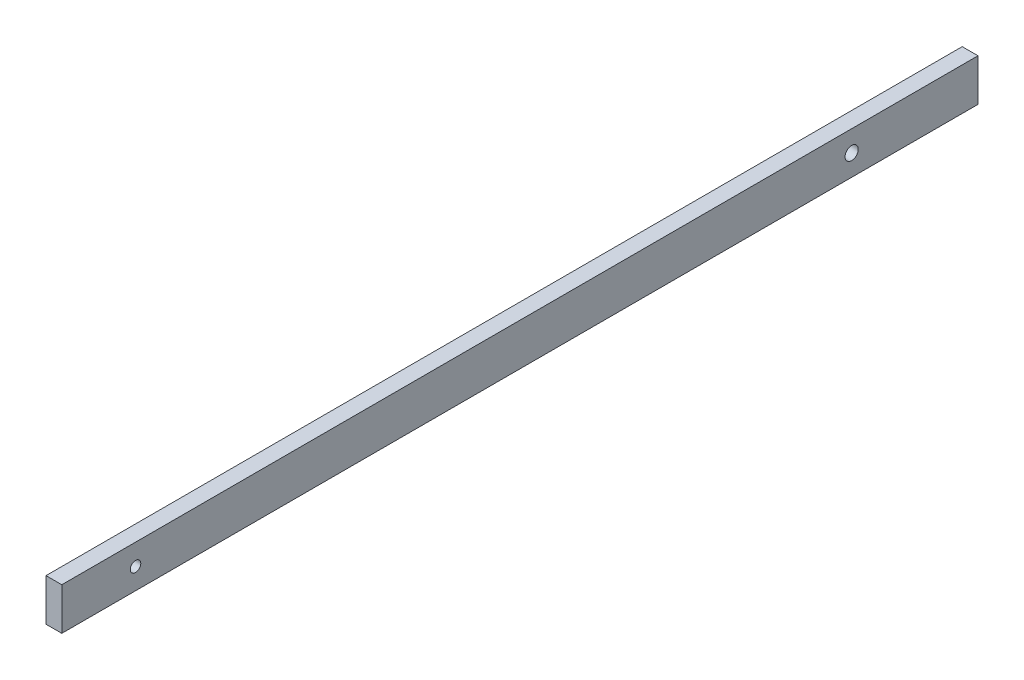
ISO-10303-21;
HEADER;
FILE_DESCRIPTION(('STEP AP214'),'2;1');
FILE_NAME('part.step','',(''),(''),'','','');
FILE_SCHEMA(('AUTOMOTIVE_DESIGN { 1 0 10303 214 1 1 1 1 }'));
ENDSEC;
DATA;
#1=APPLICATION_CONTEXT('core data for automotive mechanical design processes');
#2=APPLICATION_PROTOCOL_DEFINITION('international standard','automotive_design',2000,#1);
#3=PRODUCT_CONTEXT('',#1,'mechanical');
#4=PRODUCT('Part','Part','',(#3));
#5=PRODUCT_RELATED_PRODUCT_CATEGORY('part','',(#4));
#6=PRODUCT_DEFINITION_FORMATION('','',#4);
#7=PRODUCT_DEFINITION_CONTEXT('part definition',#1,'design');
#8=PRODUCT_DEFINITION('design','',#6,#7);
#9=PRODUCT_DEFINITION_SHAPE('','',#8);
#10=(LENGTH_UNIT() NAMED_UNIT(*) SI_UNIT(.MILLI.,.METRE.));
#11=(NAMED_UNIT(*) PLANE_ANGLE_UNIT() SI_UNIT($,.RADIAN.));
#12=(NAMED_UNIT(*) SI_UNIT($,.STERADIAN.) SOLID_ANGLE_UNIT());
#13=UNCERTAINTY_MEASURE_WITH_UNIT(LENGTH_MEASURE(1.E-05),#10,'distance_accuracy_value','');
#14=(GEOMETRIC_REPRESENTATION_CONTEXT(3) GLOBAL_UNCERTAINTY_ASSIGNED_CONTEXT((#13)) GLOBAL_UNIT_ASSIGNED_CONTEXT((#10,
#11,#12)) REPRESENTATION_CONTEXT('',''));
#15=CARTESIAN_POINT('',(0.,0.,0.));
#16=DIRECTION('',(0.,0.,1.));
#17=DIRECTION('',(1.,0.,0.));
#18=AXIS2_PLACEMENT_3D('',#15,#16,#17);
#19=CARTESIAN_POINT('',(9.525,-50.8,552.45));
#20=DIRECTION('',(1.,0.,0.));
#21=DIRECTION('',(0.,0.,-1.));
#22=AXIS2_PLACEMENT_3D('',#19,#20,#21);
#23=PLANE('',#22);
#24=CARTESIAN_POINT('',(9.525,-25.4,-400.05));
#25=DIRECTION('',(1.,0.,0.));
#26=DIRECTION('',(0.,0.,-1.));
#27=AXIS2_PLACEMENT_3D('',#24,#25,#26);
#28=CIRCLE('',#27,7.93749999999998);
#29=CARTESIAN_POINT('',(9.525,-25.4,-407.9875));
#30=VERTEX_POINT('',#29);
#31=EDGE_CURVE('E143',#30,#30,#28,.T.);
#32=ORIENTED_EDGE('',*,*,#31,.F.);
#33=EDGE_LOOP('',(#32));
#34=FACE_BOUND('',#33,.T.);
#35=CARTESIAN_POINT('',(9.525,-25.4,463.55));
#36=DIRECTION('',(1.,0.,0.));
#37=DIRECTION('',(0.,0.,-1.));
#38=AXIS2_PLACEMENT_3D('',#35,#36,#37);
#39=CIRCLE('',#38,6.35);
#40=CARTESIAN_POINT('',(9.525,-25.4,457.2));
#41=VERTEX_POINT('',#40);
#42=EDGE_CURVE('E148',#41,#41,#39,.T.);
#43=ORIENTED_EDGE('',*,*,#42,.F.);
#44=EDGE_LOOP('',(#43));
#45=FACE_BOUND('',#44,.T.);
#46=DIRECTION('',(0.,0.,-1.));
#47=VECTOR('',#46,1.);
#48=CARTESIAN_POINT('',(9.525,0.,552.45));
#49=LINE('',#48,#47);
#50=CARTESIAN_POINT('',(9.525,0.,552.45));
#51=VERTEX_POINT('',#50);
#52=CARTESIAN_POINT('',(9.525,0.,-552.45));
#53=VERTEX_POINT('',#52);
#54=EDGE_CURVE('E98',#51,#53,#49,.T.);
#55=ORIENTED_EDGE('',*,*,#54,.F.);
#56=DIRECTION('',(0.,1.,0.));
#57=VECTOR('',#56,1.);
#58=CARTESIAN_POINT('',(9.525,-50.8,552.45));
#59=LINE('',#58,#57);
#60=CARTESIAN_POINT('',(9.525,-50.8,552.45));
#61=VERTEX_POINT('',#60);
#62=EDGE_CURVE('E11',#61,#51,#59,.T.);
#63=ORIENTED_EDGE('',*,*,#62,.F.);
#64=DIRECTION('',(0.,0.,-1.));
#65=VECTOR('',#64,1.);
#66=CARTESIAN_POINT('',(9.525,-50.8,552.45));
#67=LINE('',#66,#65);
#68=CARTESIAN_POINT('',(9.525,-50.8,-552.45));
#69=VERTEX_POINT('',#68);
#70=EDGE_CURVE('E91',#61,#69,#67,.T.);
#71=ORIENTED_EDGE('',*,*,#70,.T.);
#72=DIRECTION('',(0.,1.,0.));
#73=VECTOR('',#72,1.);
#74=CARTESIAN_POINT('',(9.525,-50.8,-552.45));
#75=LINE('',#74,#73);
#76=EDGE_CURVE('E36',#69,#53,#75,.T.);
#77=ORIENTED_EDGE('',*,*,#76,.T.);
#78=EDGE_LOOP('',(#55,#63,#71,#77));
#79=FACE_BOUND('',#78,.T.);
#80=ADVANCED_FACE('F33',(#34,#45,#79),#23,.T.);
#81=CARTESIAN_POINT('',(-9.525,-50.8,552.45));
#82=DIRECTION('',(0.,0.,1.));
#83=DIRECTION('',(1.,0.,0.));
#84=AXIS2_PLACEMENT_3D('',#81,#82,#83);
#85=PLANE('',#84);
#86=DIRECTION('',(1.,0.,0.));
#87=VECTOR('',#86,1.);
#88=CARTESIAN_POINT('',(-9.525,0.,552.45));
#89=LINE('',#88,#87);
#90=CARTESIAN_POINT('',(-9.525,0.,552.45));
#91=VERTEX_POINT('',#90);
#92=EDGE_CURVE('E93',#91,#51,#89,.T.);
#93=ORIENTED_EDGE('',*,*,#92,.F.);
#94=DIRECTION('',(0.,1.,0.));
#95=VECTOR('',#94,1.);
#96=CARTESIAN_POINT('',(-9.525,-50.8,552.45));
#97=LINE('',#96,#95);
#98=CARTESIAN_POINT('',(-9.525,-50.8,552.45));
#99=VERTEX_POINT('',#98);
#100=EDGE_CURVE('E42',#99,#91,#97,.T.);
#101=ORIENTED_EDGE('',*,*,#100,.F.);
#102=DIRECTION('',(1.,0.,0.));
#103=VECTOR('',#102,1.);
#104=CARTESIAN_POINT('',(-9.525,-50.8,552.45));
#105=LINE('',#104,#103);
#106=EDGE_CURVE('E88',#99,#61,#105,.T.);
#107=ORIENTED_EDGE('',*,*,#106,.T.);
#108=ORIENTED_EDGE('',*,*,#62,.T.);
#109=EDGE_LOOP('',(#93,#101,#107,#108));
#110=FACE_BOUND('',#109,.T.);
#111=ADVANCED_FACE('F109',(#110),#85,.T.);
#112=CARTESIAN_POINT('',(-9.525,-50.8,552.45));
#113=DIRECTION('',(-1.,0.,0.));
#114=DIRECTION('',(0.,0.,1.));
#115=AXIS2_PLACEMENT_3D('',#112,#113,#114);
#116=PLANE('',#115);
#117=CARTESIAN_POINT('',(-9.525,-25.4,-400.05));
#118=DIRECTION('',(1.,0.,0.));
#119=DIRECTION('',(0.,0.,-1.));
#120=AXIS2_PLACEMENT_3D('',#117,#118,#119);
#121=CIRCLE('',#120,7.93749999999998);
#122=CARTESIAN_POINT('',(-9.52500000000001,-25.4,-407.9875));
#123=VERTEX_POINT('',#122);
#124=EDGE_CURVE('E102',#123,#123,#121,.T.);
#125=ORIENTED_EDGE('',*,*,#124,.T.);
#126=EDGE_LOOP('',(#125));
#127=FACE_BOUND('',#126,.T.);
#128=CARTESIAN_POINT('',(-9.525,-25.4,463.55));
#129=DIRECTION('',(1.,0.,0.));
#130=DIRECTION('',(0.,0.,-1.));
#131=AXIS2_PLACEMENT_3D('',#128,#129,#130);
#132=CIRCLE('',#131,6.35);
#133=CARTESIAN_POINT('',(-9.525,-25.4,457.2));
#134=VERTEX_POINT('',#133);
#135=EDGE_CURVE('E144',#134,#134,#132,.T.);
#136=ORIENTED_EDGE('',*,*,#135,.T.);
#137=EDGE_LOOP('',(#136));
#138=FACE_BOUND('',#137,.T.);
#139=DIRECTION('',(0.,0.,1.));
#140=VECTOR('',#139,1.);
#141=CARTESIAN_POINT('',(-9.525,0.,552.45));
#142=LINE('',#141,#140);
#143=CARTESIAN_POINT('',(-9.525,0.,-552.45));
#144=VERTEX_POINT('',#143);
#145=EDGE_CURVE('E83',#144,#91,#142,.T.);
#146=ORIENTED_EDGE('',*,*,#145,.F.);
#147=DIRECTION('',(0.,1.,0.));
#148=VECTOR('',#147,1.);
#149=CARTESIAN_POINT('',(-9.525,-50.8,-552.45));
#150=LINE('',#149,#148);
#151=CARTESIAN_POINT('',(-9.525,-50.8,-552.45));
#152=VERTEX_POINT('',#151);
#153=EDGE_CURVE('E78',#152,#144,#150,.T.);
#154=ORIENTED_EDGE('',*,*,#153,.F.);
#155=DIRECTION('',(0.,0.,1.));
#156=VECTOR('',#155,1.);
#157=CARTESIAN_POINT('',(-9.525,-50.8,552.45));
#158=LINE('',#157,#156);
#159=EDGE_CURVE('E81',#152,#99,#158,.T.);
#160=ORIENTED_EDGE('',*,*,#159,.T.);
#161=ORIENTED_EDGE('',*,*,#100,.T.);
#162=EDGE_LOOP('',(#146,#154,#160,#161));
#163=FACE_BOUND('',#162,.T.);
#164=ADVANCED_FACE('F80',(#127,#138,#163),#116,.T.);
#165=CARTESIAN_POINT('',(-9.525,-50.8,-552.45));
#166=DIRECTION('',(0.,0.,-1.));
#167=DIRECTION('',(-1.,0.,0.));
#168=AXIS2_PLACEMENT_3D('',#165,#166,#167);
#169=PLANE('',#168);
#170=DIRECTION('',(-1.,0.,0.));
#171=VECTOR('',#170,1.);
#172=CARTESIAN_POINT('',(-9.525,0.,-552.45));
#173=LINE('',#172,#171);
#174=EDGE_CURVE('E101',#53,#144,#173,.T.);
#175=ORIENTED_EDGE('',*,*,#174,.F.);
#176=ORIENTED_EDGE('',*,*,#76,.F.);
#177=DIRECTION('',(-1.,0.,0.));
#178=VECTOR('',#177,1.);
#179=CARTESIAN_POINT('',(-9.525,-50.8,-552.45));
#180=LINE('',#179,#178);
#181=EDGE_CURVE('E87',#69,#152,#180,.T.);
#182=ORIENTED_EDGE('',*,*,#181,.T.);
#183=ORIENTED_EDGE('',*,*,#153,.T.);
#184=EDGE_LOOP('',(#175,#176,#182,#183));
#185=FACE_BOUND('',#184,.T.);
#186=ADVANCED_FACE('F90',(#185),#169,.T.);
#187=CARTESIAN_POINT('',(0.,-50.8,0.));
#188=DIRECTION('',(0.,-1.,0.));
#189=DIRECTION('',(0.,0.,-1.));
#190=AXIS2_PLACEMENT_3D('',#187,#188,#189);
#191=PLANE('',#190);
#192=ORIENTED_EDGE('',*,*,#70,.F.);
#193=ORIENTED_EDGE('',*,*,#106,.F.);
#194=ORIENTED_EDGE('',*,*,#159,.F.);
#195=ORIENTED_EDGE('',*,*,#181,.F.);
#196=EDGE_LOOP('',(#192,#193,#194,#195));
#197=FACE_BOUND('',#196,.T.);
#198=ADVANCED_FACE('F86',(#197),#191,.T.);
#199=CARTESIAN_POINT('',(0.,0.,0.));
#200=DIRECTION('',(0.,-1.,0.));
#201=DIRECTION('',(0.,0.,-1.));
#202=AXIS2_PLACEMENT_3D('',#199,#200,#201);
#203=PLANE('',#202);
#204=ORIENTED_EDGE('',*,*,#54,.T.);
#205=ORIENTED_EDGE('',*,*,#174,.T.);
#206=ORIENTED_EDGE('',*,*,#145,.T.);
#207=ORIENTED_EDGE('',*,*,#92,.T.);
#208=EDGE_LOOP('',(#204,#205,#206,#207));
#209=FACE_BOUND('',#208,.T.);
#210=ADVANCED_FACE('F108',(#209),#203,.F.);
#211=CARTESIAN_POINT('',(-9.525,-25.4,463.55));
#212=DIRECTION('',(1.,0.,0.));
#213=DIRECTION('',(0.,0.,-1.));
#214=AXIS2_PLACEMENT_3D('',#211,#212,#213);
#215=CYLINDRICAL_SURFACE('',#214,6.35);
#216=CARTESIAN_POINT('',(-9.525,-25.4,457.2));
#217=CARTESIAN_POINT('',(-9.3265625,-25.4,457.2));
#218=CARTESIAN_POINT('',(-9.128125,-25.4,457.2));
#219=CARTESIAN_POINT('',(-8.73125,-25.4,457.2));
#220=CARTESIAN_POINT('',(-8.53281250000001,-25.4,457.2));
#221=CARTESIAN_POINT('',(-8.1359375,-25.4,457.2));
#222=CARTESIAN_POINT('',(-7.93750000000001,-25.4,457.2));
#223=CARTESIAN_POINT('',(-7.540625,-25.4,457.2));
#224=CARTESIAN_POINT('',(-7.3421875,-25.4,457.2));
#225=CARTESIAN_POINT('',(-6.9453125,-25.4,457.2));
#226=CARTESIAN_POINT('',(-6.746875,-25.4,457.2));
#227=CARTESIAN_POINT('',(-6.35,-25.4,457.2));
#228=CARTESIAN_POINT('',(-6.1515625,-25.4,457.2));
#229=CARTESIAN_POINT('',(-5.7546875,-25.4,457.2));
#230=CARTESIAN_POINT('',(-5.55625,-25.4,457.2));
#231=CARTESIAN_POINT('',(-5.15937500000001,-25.4,457.2));
#232=CARTESIAN_POINT('',(-4.9609375,-25.4,457.2));
#233=CARTESIAN_POINT('',(-4.5640625,-25.4,457.2));
#234=CARTESIAN_POINT('',(-4.365625,-25.4,457.2));
#235=CARTESIAN_POINT('',(-3.96875,-25.4,457.2));
#236=CARTESIAN_POINT('',(-3.7703125,-25.4,457.2));
#237=CARTESIAN_POINT('',(-3.3734375,-25.4,457.2));
#238=CARTESIAN_POINT('',(-3.175,-25.4,457.2));
#239=CARTESIAN_POINT('',(-2.778125,-25.4,457.2));
#240=CARTESIAN_POINT('',(-2.5796875,-25.4,457.2));
#241=CARTESIAN_POINT('',(-2.1828125,-25.4,457.2));
#242=CARTESIAN_POINT('',(-1.984375,-25.4,457.2));
#243=CARTESIAN_POINT('',(-1.5875,-25.4,457.2));
#244=CARTESIAN_POINT('',(-1.3890625,-25.4,457.2));
#245=CARTESIAN_POINT('',(-0.992187500000004,-25.4,457.2));
#246=CARTESIAN_POINT('',(-0.793750000000004,-25.4,457.2));
#247=CARTESIAN_POINT('',(-0.396875000000004,-25.4,457.2));
#248=CARTESIAN_POINT('',(-0.198437500000004,-25.4,457.2));
#249=CARTESIAN_POINT('',(0.198437499999997,-25.4,457.2));
#250=CARTESIAN_POINT('',(0.396874999999997,-25.4,457.2));
#251=CARTESIAN_POINT('',(0.793749999999997,-25.4,457.2));
#252=CARTESIAN_POINT('',(0.992187499999997,-25.4,457.2));
#253=CARTESIAN_POINT('',(1.3890625,-25.4,457.2));
#254=CARTESIAN_POINT('',(1.5875,-25.4,457.2));
#255=CARTESIAN_POINT('',(1.984375,-25.4,457.2));
#256=CARTESIAN_POINT('',(2.1828125,-25.4,457.2));
#257=CARTESIAN_POINT('',(2.5796875,-25.4,457.2));
#258=CARTESIAN_POINT('',(2.778125,-25.4,457.2));
#259=CARTESIAN_POINT('',(3.175,-25.4,457.2));
#260=CARTESIAN_POINT('',(3.3734375,-25.4,457.2));
#261=CARTESIAN_POINT('',(3.7703125,-25.4,457.2));
#262=CARTESIAN_POINT('',(3.96875,-25.4,457.2));
#263=CARTESIAN_POINT('',(4.365625,-25.4,457.2));
#264=CARTESIAN_POINT('',(4.5640625,-25.4,457.2));
#265=CARTESIAN_POINT('',(4.9609375,-25.4,457.2));
#266=CARTESIAN_POINT('',(5.159375,-25.4,457.2));
#267=CARTESIAN_POINT('',(5.55625,-25.4,457.2));
#268=CARTESIAN_POINT('',(5.7546875,-25.4,457.2));
#269=CARTESIAN_POINT('',(6.1515625,-25.4,457.2));
#270=CARTESIAN_POINT('',(6.35,-25.4,457.2));
#271=CARTESIAN_POINT('',(6.74687499999999,-25.4,457.2));
#272=CARTESIAN_POINT('',(6.9453125,-25.4,457.2));
#273=CARTESIAN_POINT('',(7.3421875,-25.4,457.2));
#274=CARTESIAN_POINT('',(7.540625,-25.4,457.2));
#275=CARTESIAN_POINT('',(7.9375,-25.4,457.2));
#276=CARTESIAN_POINT('',(8.1359375,-25.4,457.2));
#277=CARTESIAN_POINT('',(8.5328125,-25.4,457.2));
#278=CARTESIAN_POINT('',(8.73125,-25.4,457.2));
#279=CARTESIAN_POINT('',(9.128125,-25.4,457.2));
#280=CARTESIAN_POINT('',(9.3265625,-25.4,457.2));
#281=CARTESIAN_POINT('',(9.525,-25.4,457.2));
#282=B_SPLINE_CURVE_WITH_KNOTS('',3,(#216,#217,#218,#219,#220,#221,#222,#223,#224,#225,#226,
#227,#228,#229,#230,#231,#232,#233,#234,#235,#236,#237,#238,#239,#240,#241,#242,#243,#244,#245,
#246,#247,#248,#249,#250,#251,#252,#253,#254,#255,#256,#257,#258,#259,#260,#261,#262,#263,#264,
#265,#266,#267,#268,#269,#270,#271,#272,#273,#274,#275,#276,#277,#278,#279,#280,#281),
.UNSPECIFIED.,.F.,.F.,(4,2,2,2,2,2,2,2,2,2,2,2,2,2,2,2,2,2,2,2,2,2,2,2,2,2,2,2,2,2,2,2,4),(0.,
0.595312499999999,1.190625,1.7859375,2.38125,2.9765625,3.571875,4.1671875,4.7625,5.3578125,
5.953125,6.5484375,7.14375,7.7390625,8.334375,8.9296875,9.525,10.1203125,10.715625,11.3109375,
11.90625,12.5015625,13.096875,13.6921875,14.2875,14.8828125,15.478125,16.0734375,16.66875,
17.2640625,17.859375,18.4546875,19.05),.UNSPECIFIED.);
#283=EDGE_CURVE('BSEAM128',#134,#41,#282,.T.);
#284=ORIENTED_EDGE('',*,*,#135,.F.);
#285=ORIENTED_EDGE('',*,*,#42,.T.);
#286=ORIENTED_EDGE('',*,*,#283,.T.);
#287=ORIENTED_EDGE('',*,*,#283,.F.);
#288=EDGE_LOOP('',(#284,#286,#285,#287));
#289=FACE_BOUND('',#288,.T.);
#290=ADVANCED_FACE('F128',(#289),#215,.F.);
#291=CARTESIAN_POINT('',(-9.525,-25.4,-400.05));
#292=DIRECTION('',(1.,0.,0.));
#293=DIRECTION('',(0.,0.,-1.));
#294=AXIS2_PLACEMENT_3D('',#291,#292,#293);
#295=CYLINDRICAL_SURFACE('',#294,7.93749999999998);
#296=CARTESIAN_POINT('',(-9.52500000000001,-25.4,-407.9875));
#297=CARTESIAN_POINT('',(-9.3265625,-25.4,-407.9875));
#298=CARTESIAN_POINT('',(-9.12812500000001,-25.4,-407.9875));
#299=CARTESIAN_POINT('',(-8.73125,-25.4,-407.9875));
#300=CARTESIAN_POINT('',(-8.53281250000001,-25.4,-407.9875));
#301=CARTESIAN_POINT('',(-8.1359375,-25.4,-407.9875));
#302=CARTESIAN_POINT('',(-7.93750000000001,-25.4,-407.9875));
#303=CARTESIAN_POINT('',(-7.540625,-25.4,-407.9875));
#304=CARTESIAN_POINT('',(-7.3421875,-25.4,-407.9875));
#305=CARTESIAN_POINT('',(-6.9453125,-25.4,-407.9875));
#306=CARTESIAN_POINT('',(-6.746875,-25.4,-407.9875));
#307=CARTESIAN_POINT('',(-6.35,-25.4,-407.9875));
#308=CARTESIAN_POINT('',(-6.1515625,-25.4,-407.9875));
#309=CARTESIAN_POINT('',(-5.7546875,-25.4,-407.9875));
#310=CARTESIAN_POINT('',(-5.55625,-25.4,-407.9875));
#311=CARTESIAN_POINT('',(-5.15937500000001,-25.4,-407.9875));
#312=CARTESIAN_POINT('',(-4.9609375,-25.4,-407.9875));
#313=CARTESIAN_POINT('',(-4.5640625,-25.4,-407.9875));
#314=CARTESIAN_POINT('',(-4.365625,-25.4,-407.9875));
#315=CARTESIAN_POINT('',(-3.96875,-25.4,-407.9875));
#316=CARTESIAN_POINT('',(-3.7703125,-25.4,-407.9875));
#317=CARTESIAN_POINT('',(-3.3734375,-25.4,-407.9875));
#318=CARTESIAN_POINT('',(-3.175,-25.4,-407.9875));
#319=CARTESIAN_POINT('',(-2.778125,-25.4,-407.9875));
#320=CARTESIAN_POINT('',(-2.5796875,-25.4,-407.9875));
#321=CARTESIAN_POINT('',(-2.1828125,-25.4,-407.9875));
#322=CARTESIAN_POINT('',(-1.984375,-25.4,-407.9875));
#323=CARTESIAN_POINT('',(-1.5875,-25.4,-407.9875));
#324=CARTESIAN_POINT('',(-1.38906250000001,-25.4,-407.9875));
#325=CARTESIAN_POINT('',(-0.992187500000006,-25.4,-407.9875));
#326=CARTESIAN_POINT('',(-0.793750000000006,-25.4,-407.9875));
#327=CARTESIAN_POINT('',(-0.396875000000005,-25.4,-407.9875));
#328=CARTESIAN_POINT('',(-0.198437500000005,-25.4,-407.9875));
#329=CARTESIAN_POINT('',(0.198437499999995,-25.4,-407.9875));
#330=CARTESIAN_POINT('',(0.396874999999995,-25.4,-407.9875));
#331=CARTESIAN_POINT('',(0.793749999999995,-25.4,-407.9875));
#332=CARTESIAN_POINT('',(0.992187499999995,-25.4,-407.9875));
#333=CARTESIAN_POINT('',(1.3890625,-25.4,-407.9875));
#334=CARTESIAN_POINT('',(1.5875,-25.4,-407.9875));
#335=CARTESIAN_POINT('',(1.984375,-25.4,-407.9875));
#336=CARTESIAN_POINT('',(2.1828125,-25.4,-407.9875));
#337=CARTESIAN_POINT('',(2.5796875,-25.4,-407.9875));
#338=CARTESIAN_POINT('',(2.778125,-25.4,-407.9875));
#339=CARTESIAN_POINT('',(3.17499999999999,-25.4,-407.9875));
#340=CARTESIAN_POINT('',(3.37343749999999,-25.4,-407.9875));
#341=CARTESIAN_POINT('',(3.7703125,-25.4,-407.9875));
#342=CARTESIAN_POINT('',(3.96875,-25.4,-407.9875));
#343=CARTESIAN_POINT('',(4.365625,-25.4,-407.9875));
#344=CARTESIAN_POINT('',(4.5640625,-25.4,-407.9875));
#345=CARTESIAN_POINT('',(4.9609375,-25.4,-407.9875));
#346=CARTESIAN_POINT('',(5.159375,-25.4,-407.9875));
#347=CARTESIAN_POINT('',(5.55625,-25.4,-407.9875));
#348=CARTESIAN_POINT('',(5.7546875,-25.4,-407.9875));
#349=CARTESIAN_POINT('',(6.1515625,-25.4,-407.9875));
#350=CARTESIAN_POINT('',(6.35,-25.4,-407.9875));
#351=CARTESIAN_POINT('',(6.74687499999999,-25.4,-407.9875));
#352=CARTESIAN_POINT('',(6.9453125,-25.4,-407.9875));
#353=CARTESIAN_POINT('',(7.3421875,-25.4,-407.9875));
#354=CARTESIAN_POINT('',(7.540625,-25.4,-407.9875));
#355=CARTESIAN_POINT('',(7.9375,-25.4,-407.9875));
#356=CARTESIAN_POINT('',(8.1359375,-25.4,-407.9875));
#357=CARTESIAN_POINT('',(8.5328125,-25.4,-407.9875));
#358=CARTESIAN_POINT('',(8.73125,-25.4,-407.9875));
#359=CARTESIAN_POINT('',(9.128125,-25.4,-407.9875));
#360=CARTESIAN_POINT('',(9.3265625,-25.4,-407.9875));
#361=CARTESIAN_POINT('',(9.525,-25.4,-407.9875));
#362=B_SPLINE_CURVE_WITH_KNOTS('',3,(#296,#297,#298,#299,#300,#301,#302,#303,#304,#305,#306,
#307,#308,#309,#310,#311,#312,#313,#314,#315,#316,#317,#318,#319,#320,#321,#322,#323,#324,#325,
#326,#327,#328,#329,#330,#331,#332,#333,#334,#335,#336,#337,#338,#339,#340,#341,#342,#343,#344,
#345,#346,#347,#348,#349,#350,#351,#352,#353,#354,#355,#356,#357,#358,#359,#360,#361),
.UNSPECIFIED.,.F.,.F.,(4,2,2,2,2,2,2,2,2,2,2,2,2,2,2,2,2,2,2,2,2,2,2,2,2,2,2,2,2,2,2,2,4),(0.,
0.5953125,1.190625,1.7859375,2.38125,2.9765625,3.571875,4.1671875,4.7625,5.3578125,5.953125,
6.5484375,7.14375,7.7390625,8.334375,8.9296875,9.525,10.1203125,10.715625,11.3109375,11.90625,
12.5015625,13.096875,13.6921875,14.2875,14.8828125,15.478125,16.0734375,16.66875,17.2640625,
17.859375,18.4546875,19.05),.UNSPECIFIED.);
#363=EDGE_CURVE('BSEAM132',#123,#30,#362,.T.);
#364=ORIENTED_EDGE('',*,*,#124,.F.);
#365=ORIENTED_EDGE('',*,*,#31,.T.);
#366=ORIENTED_EDGE('',*,*,#363,.T.);
#367=ORIENTED_EDGE('',*,*,#363,.F.);
#368=EDGE_LOOP('',(#364,#366,#365,#367));
#369=FACE_BOUND('',#368,.T.);
#370=ADVANCED_FACE('F132',(#369),#295,.F.);
#371=CLOSED_SHELL('',(#80,#111,#164,#186,#198,#210,#290,#370));
#372=MANIFOLD_SOLID_BREP('B2',#371);
#373=ADVANCED_BREP_SHAPE_REPRESENTATION('',(#18,#372),#14);
#374=SHAPE_DEFINITION_REPRESENTATION(#9,#373);
ENDSEC;
END-ISO-10303-21;
